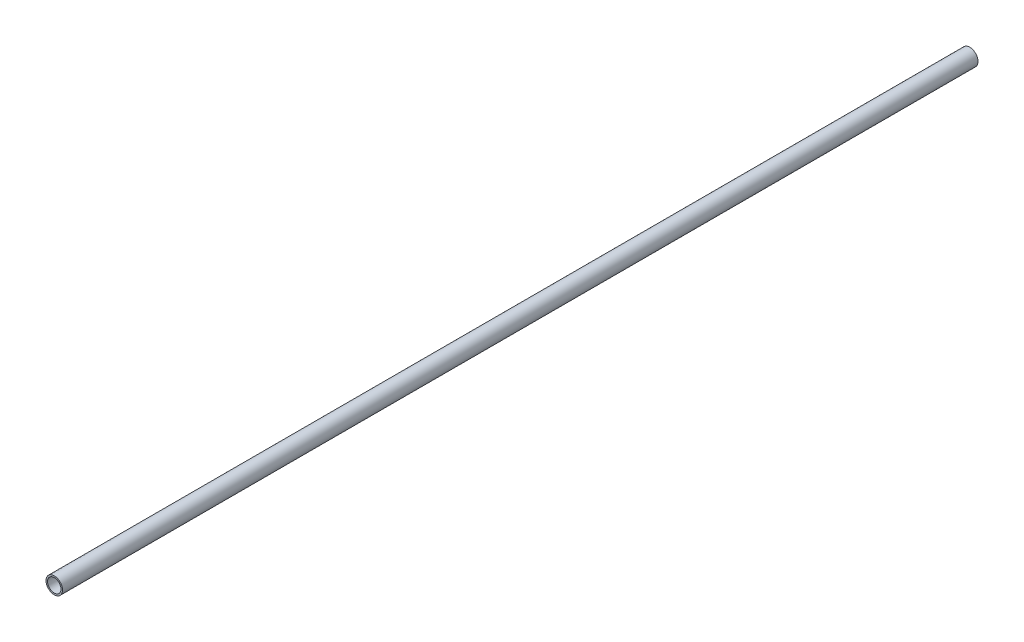
ISO-10303-21;
HEADER;
FILE_DESCRIPTION(('STEP AP214'),'2;1');
FILE_NAME('part.step','',(''),(''),'','','');
FILE_SCHEMA(('AUTOMOTIVE_DESIGN { 1 0 10303 214 1 1 1 1 }'));
ENDSEC;
DATA;
#1=APPLICATION_CONTEXT('core data for automotive mechanical design processes');
#2=APPLICATION_PROTOCOL_DEFINITION('international standard','automotive_design',2000,#1);
#3=PRODUCT_CONTEXT('',#1,'mechanical');
#4=PRODUCT('Part','Part','',(#3));
#5=PRODUCT_RELATED_PRODUCT_CATEGORY('part','',(#4));
#6=PRODUCT_DEFINITION_FORMATION('','',#4);
#7=PRODUCT_DEFINITION_CONTEXT('part definition',#1,'design');
#8=PRODUCT_DEFINITION('design','',#6,#7);
#9=PRODUCT_DEFINITION_SHAPE('','',#8);
#10=(LENGTH_UNIT() NAMED_UNIT(*) SI_UNIT(.MILLI.,.METRE.));
#11=(NAMED_UNIT(*) PLANE_ANGLE_UNIT() SI_UNIT($,.RADIAN.));
#12=(NAMED_UNIT(*) SI_UNIT($,.STERADIAN.) SOLID_ANGLE_UNIT());
#13=UNCERTAINTY_MEASURE_WITH_UNIT(LENGTH_MEASURE(1.E-05),#10,'distance_accuracy_value','');
#14=(GEOMETRIC_REPRESENTATION_CONTEXT(3) GLOBAL_UNCERTAINTY_ASSIGNED_CONTEXT((#13)) GLOBAL_UNIT_ASSIGNED_CONTEXT((#10,
#11,#12)) REPRESENTATION_CONTEXT('',''));
#15=CARTESIAN_POINT('',(0.,0.,0.));
#16=DIRECTION('',(0.,0.,1.));
#17=DIRECTION('',(1.,0.,0.));
#18=AXIS2_PLACEMENT_3D('',#15,#16,#17);
#19=CARTESIAN_POINT('',(0.,0.,1185.));
#20=DIRECTION('',(0.,0.,1.));
#21=DIRECTION('',(1.,0.,0.));
#22=AXIS2_PLACEMENT_3D('',#19,#20,#21);
#23=PLANE('',#22);
#24=CARTESIAN_POINT('',(0.,0.,1185.));
#25=DIRECTION('',(0.,0.,1.));
#26=DIRECTION('',(1.,0.,0.));
#27=AXIS2_PLACEMENT_3D('',#24,#25,#26);
#28=CIRCLE('',#27,21.35);
#29=CARTESIAN_POINT('',(-21.35,0.,1185.));
#30=VERTEX_POINT('',#29);
#31=EDGE_CURVE('E10',#30,#30,#28,.T.);
#32=ORIENTED_EDGE('',*,*,#31,.T.);
#33=EDGE_LOOP('',(#32));
#34=FACE_BOUND('',#33,.T.);
#35=CARTESIAN_POINT('',(0.,0.,1185.));
#36=DIRECTION('',(0.,0.,1.));
#37=DIRECTION('',(1.,0.,0.));
#38=AXIS2_PLACEMENT_3D('',#35,#36,#37);
#39=CIRCLE('',#38,17.35);
#40=CARTESIAN_POINT('',(-17.35,0.,1185.));
#41=VERTEX_POINT('',#40);
#42=EDGE_CURVE('E54',#41,#41,#39,.T.);
#43=ORIENTED_EDGE('',*,*,#42,.F.);
#44=EDGE_LOOP('',(#43));
#45=FACE_BOUND('',#44,.T.);
#46=ADVANCED_FACE('F40',(#34,#45),#23,.T.);
#47=CARTESIAN_POINT('',(0.,0.,-1185.));
#48=DIRECTION('',(0.,0.,1.));
#49=DIRECTION('',(1.,0.,0.));
#50=AXIS2_PLACEMENT_3D('',#47,#48,#49);
#51=PLANE('',#50);
#52=CARTESIAN_POINT('',(0.,0.,-1185.));
#53=DIRECTION('',(0.,0.,1.));
#54=DIRECTION('',(1.,0.,0.));
#55=AXIS2_PLACEMENT_3D('',#52,#53,#54);
#56=CIRCLE('',#55,21.35);
#57=CARTESIAN_POINT('',(-21.35,0.,-1185.));
#58=VERTEX_POINT('',#57);
#59=EDGE_CURVE('E44',#58,#58,#56,.T.);
#60=ORIENTED_EDGE('',*,*,#59,.F.);
#61=EDGE_LOOP('',(#60));
#62=FACE_BOUND('',#61,.T.);
#63=CARTESIAN_POINT('',(0.,0.,-1185.));
#64=DIRECTION('',(0.,0.,1.));
#65=DIRECTION('',(1.,0.,0.));
#66=AXIS2_PLACEMENT_3D('',#63,#64,#65);
#67=CIRCLE('',#66,17.35);
#68=CARTESIAN_POINT('',(-17.35,0.,-1185.));
#69=VERTEX_POINT('',#68);
#70=EDGE_CURVE('E56',#69,#69,#67,.T.);
#71=ORIENTED_EDGE('',*,*,#70,.T.);
#72=EDGE_LOOP('',(#71));
#73=FACE_BOUND('',#72,.T.);
#74=ADVANCED_FACE('F67',(#62,#73),#51,.F.);
#75=CARTESIAN_POINT('',(0.,0.,1185.));
#76=DIRECTION('',(0.,0.,-1.));
#77=DIRECTION('',(-1.,0.,0.));
#78=AXIS2_PLACEMENT_3D('',#75,#76,#77);
#79=CYLINDRICAL_SURFACE('',#78,21.35);
#80=CARTESIAN_POINT('',(-21.35,0.,1185.));
#81=CARTESIAN_POINT('',(-21.35,0.,1160.3125));
#82=CARTESIAN_POINT('',(-21.35,0.,1135.625));
#83=CARTESIAN_POINT('',(-21.35,0.,1086.25));
#84=CARTESIAN_POINT('',(-21.35,0.,1061.5625));
#85=CARTESIAN_POINT('',(-21.35,0.,1012.1875));
#86=CARTESIAN_POINT('',(-21.35,0.,987.5));
#87=CARTESIAN_POINT('',(-21.35,0.,938.125));
#88=CARTESIAN_POINT('',(-21.35,0.,913.4375));
#89=CARTESIAN_POINT('',(-21.35,0.,864.0625));
#90=CARTESIAN_POINT('',(-21.35,0.,839.375));
#91=CARTESIAN_POINT('',(-21.35,0.,790.));
#92=CARTESIAN_POINT('',(-21.35,0.,765.3125));
#93=CARTESIAN_POINT('',(-21.35,0.,715.9375));
#94=CARTESIAN_POINT('',(-21.35,0.,691.25));
#95=CARTESIAN_POINT('',(-21.35,0.,641.875));
#96=CARTESIAN_POINT('',(-21.35,0.,617.1875));
#97=CARTESIAN_POINT('',(-21.35,0.,567.8125));
#98=CARTESIAN_POINT('',(-21.35,0.,543.125));
#99=CARTESIAN_POINT('',(-21.35,0.,493.75));
#100=CARTESIAN_POINT('',(-21.35,0.,469.0625));
#101=CARTESIAN_POINT('',(-21.35,0.,419.6875));
#102=CARTESIAN_POINT('',(-21.35,0.,395.));
#103=CARTESIAN_POINT('',(-21.35,0.,345.625));
#104=CARTESIAN_POINT('',(-21.35,0.,320.9375));
#105=CARTESIAN_POINT('',(-21.35,0.,271.5625));
#106=CARTESIAN_POINT('',(-21.35,0.,246.875));
#107=CARTESIAN_POINT('',(-21.35,0.,197.5));
#108=CARTESIAN_POINT('',(-21.35,0.,172.8125));
#109=CARTESIAN_POINT('',(-21.35,0.,123.4375));
#110=CARTESIAN_POINT('',(-21.35,0.,98.7499999999997));
#111=CARTESIAN_POINT('',(-21.35,0.,49.3749999999997));
#112=CARTESIAN_POINT('',(-21.35,0.,24.6874999999996));
#113=CARTESIAN_POINT('',(-21.35,0.,-24.6875000000005));
#114=CARTESIAN_POINT('',(-21.35,0.,-49.3750000000005));
#115=CARTESIAN_POINT('',(-21.35,0.,-98.7500000000006));
#116=CARTESIAN_POINT('',(-21.35,0.,-123.437500000001));
#117=CARTESIAN_POINT('',(-21.35,0.,-172.8125));
#118=CARTESIAN_POINT('',(-21.35,0.,-197.5));
#119=CARTESIAN_POINT('',(-21.35,0.,-246.875));
#120=CARTESIAN_POINT('',(-21.35,0.,-271.562500000001));
#121=CARTESIAN_POINT('',(-21.35,0.,-320.937500000001));
#122=CARTESIAN_POINT('',(-21.35,0.,-345.625000000001));
#123=CARTESIAN_POINT('',(-21.35,0.,-395.000000000001));
#124=CARTESIAN_POINT('',(-21.35,0.,-419.687500000001));
#125=CARTESIAN_POINT('',(-21.35,0.,-469.062500000001));
#126=CARTESIAN_POINT('',(-21.35,0.,-493.750000000001));
#127=CARTESIAN_POINT('',(-21.35,0.,-543.125000000001));
#128=CARTESIAN_POINT('',(-21.35,0.,-567.812500000001));
#129=CARTESIAN_POINT('',(-21.35,0.,-617.187500000001));
#130=CARTESIAN_POINT('',(-21.35,0.,-641.875000000001));
#131=CARTESIAN_POINT('',(-21.35,0.,-691.250000000001));
#132=CARTESIAN_POINT('',(-21.35,0.,-715.937500000001));
#133=CARTESIAN_POINT('',(-21.35,0.,-765.312500000001));
#134=CARTESIAN_POINT('',(-21.35,0.,-790.000000000001));
#135=CARTESIAN_POINT('',(-21.35,0.,-839.375000000001));
#136=CARTESIAN_POINT('',(-21.35,0.,-864.0625));
#137=CARTESIAN_POINT('',(-21.35,0.,-913.4375));
#138=CARTESIAN_POINT('',(-21.35,0.,-938.125));
#139=CARTESIAN_POINT('',(-21.35,0.,-987.5));
#140=CARTESIAN_POINT('',(-21.35,0.,-1012.1875));
#141=CARTESIAN_POINT('',(-21.35,0.,-1061.5625));
#142=CARTESIAN_POINT('',(-21.35,0.,-1086.25));
#143=CARTESIAN_POINT('',(-21.35,0.,-1135.625));
#144=CARTESIAN_POINT('',(-21.35,0.,-1160.3125));
#145=CARTESIAN_POINT('',(-21.35,0.,-1185.));
#146=B_SPLINE_CURVE_WITH_KNOTS('',3,(#80,#81,#82,#83,#84,#85,#86,#87,#88,#89,#90,#91,#92,#93,
#94,#95,#96,#97,#98,#99,#100,#101,#102,#103,#104,#105,#106,#107,#108,#109,#110,#111,#112,#113,
#114,#115,#116,#117,#118,#119,#120,#121,#122,#123,#124,#125,#126,#127,#128,#129,#130,#131,#132,
#133,#134,#135,#136,#137,#138,#139,#140,#141,#142,#143,#144,#145),.UNSPECIFIED.,.F.,.F.,(4,2,2,
2,2,2,2,2,2,2,2,2,2,2,2,2,2,2,2,2,2,2,2,2,2,2,2,2,2,2,2,2,4),(0.,74.0624999999999,148.125,
222.1875,296.25,370.3125,444.375,518.4375,592.5,666.5625,740.625,814.6875,888.75,962.8125,
1036.875,1110.9375,1185.,1259.0625,1333.125,1407.1875,1481.25,1555.3125,1629.375,1703.4375,
1777.5,1851.5625,1925.625,1999.6875,2073.75,2147.8125,2221.875,2295.9375,2370.),.UNSPECIFIED.);
#147=EDGE_CURVE('BSEAM42',#30,#58,#146,.T.);
#148=ORIENTED_EDGE('',*,*,#31,.F.);
#149=ORIENTED_EDGE('',*,*,#59,.T.);
#150=ORIENTED_EDGE('',*,*,#147,.T.);
#151=ORIENTED_EDGE('',*,*,#147,.F.);
#152=EDGE_LOOP('',(#148,#150,#149,#151));
#153=FACE_BOUND('',#152,.T.);
#154=ADVANCED_FACE('F42',(#153),#79,.T.);
#155=CARTESIAN_POINT('',(0.,0.,1185.));
#156=DIRECTION('',(0.,0.,-1.));
#157=DIRECTION('',(-1.,0.,0.));
#158=AXIS2_PLACEMENT_3D('',#155,#156,#157);
#159=CYLINDRICAL_SURFACE('',#158,17.35);
#160=CARTESIAN_POINT('',(-17.35,0.,1185.));
#161=CARTESIAN_POINT('',(-17.35,0.,1160.3125));
#162=CARTESIAN_POINT('',(-17.35,0.,1135.625));
#163=CARTESIAN_POINT('',(-17.35,0.,1086.25));
#164=CARTESIAN_POINT('',(-17.35,0.,1061.5625));
#165=CARTESIAN_POINT('',(-17.35,0.,1012.1875));
#166=CARTESIAN_POINT('',(-17.35,0.,987.5));
#167=CARTESIAN_POINT('',(-17.35,0.,938.125));
#168=CARTESIAN_POINT('',(-17.35,0.,913.4375));
#169=CARTESIAN_POINT('',(-17.35,0.,864.0625));
#170=CARTESIAN_POINT('',(-17.35,0.,839.375));
#171=CARTESIAN_POINT('',(-17.35,0.,790.));
#172=CARTESIAN_POINT('',(-17.35,0.,765.3125));
#173=CARTESIAN_POINT('',(-17.35,0.,715.9375));
#174=CARTESIAN_POINT('',(-17.35,0.,691.25));
#175=CARTESIAN_POINT('',(-17.35,0.,641.875));
#176=CARTESIAN_POINT('',(-17.35,0.,617.1875));
#177=CARTESIAN_POINT('',(-17.35,0.,567.8125));
#178=CARTESIAN_POINT('',(-17.35,0.,543.125));
#179=CARTESIAN_POINT('',(-17.35,0.,493.75));
#180=CARTESIAN_POINT('',(-17.35,0.,469.0625));
#181=CARTESIAN_POINT('',(-17.35,0.,419.6875));
#182=CARTESIAN_POINT('',(-17.35,0.,395.));
#183=CARTESIAN_POINT('',(-17.35,0.,345.625));
#184=CARTESIAN_POINT('',(-17.35,0.,320.9375));
#185=CARTESIAN_POINT('',(-17.35,0.,271.5625));
#186=CARTESIAN_POINT('',(-17.35,0.,246.875));
#187=CARTESIAN_POINT('',(-17.35,0.,197.5));
#188=CARTESIAN_POINT('',(-17.35,0.,172.8125));
#189=CARTESIAN_POINT('',(-17.35,0.,123.4375));
#190=CARTESIAN_POINT('',(-17.35,0.,98.7499999999999));
#191=CARTESIAN_POINT('',(-17.35,0.,49.3749999999999));
#192=CARTESIAN_POINT('',(-17.35,0.,24.6874999999998));
#193=CARTESIAN_POINT('',(-17.35,0.,-24.6875000000003));
#194=CARTESIAN_POINT('',(-17.35,0.,-49.3750000000003));
#195=CARTESIAN_POINT('',(-17.35,0.,-98.7500000000003));
#196=CARTESIAN_POINT('',(-17.35,0.,-123.4375));
#197=CARTESIAN_POINT('',(-17.35,0.,-172.8125));
#198=CARTESIAN_POINT('',(-17.35,0.,-197.5));
#199=CARTESIAN_POINT('',(-17.35,0.,-246.875));
#200=CARTESIAN_POINT('',(-17.35,0.,-271.5625));
#201=CARTESIAN_POINT('',(-17.35,0.,-320.9375));
#202=CARTESIAN_POINT('',(-17.35,0.,-345.625));
#203=CARTESIAN_POINT('',(-17.35,0.,-395.));
#204=CARTESIAN_POINT('',(-17.35,0.,-419.6875));
#205=CARTESIAN_POINT('',(-17.35,0.,-469.0625));
#206=CARTESIAN_POINT('',(-17.35,0.,-493.75));
#207=CARTESIAN_POINT('',(-17.35,0.,-543.125));
#208=CARTESIAN_POINT('',(-17.35,0.,-567.8125));
#209=CARTESIAN_POINT('',(-17.35,0.,-617.187500000001));
#210=CARTESIAN_POINT('',(-17.35,0.,-641.875000000001));
#211=CARTESIAN_POINT('',(-17.35,0.,-691.250000000001));
#212=CARTESIAN_POINT('',(-17.35,0.,-715.937500000001));
#213=CARTESIAN_POINT('',(-17.35,0.,-765.3125));
#214=CARTESIAN_POINT('',(-17.35,0.,-790.));
#215=CARTESIAN_POINT('',(-17.35,0.,-839.375));
#216=CARTESIAN_POINT('',(-17.35,0.,-864.0625));
#217=CARTESIAN_POINT('',(-17.35,0.,-913.4375));
#218=CARTESIAN_POINT('',(-17.35,0.,-938.125));
#219=CARTESIAN_POINT('',(-17.35,0.,-987.5));
#220=CARTESIAN_POINT('',(-17.35,0.,-1012.1875));
#221=CARTESIAN_POINT('',(-17.35,0.,-1061.5625));
#222=CARTESIAN_POINT('',(-17.35,0.,-1086.25));
#223=CARTESIAN_POINT('',(-17.35,0.,-1135.625));
#224=CARTESIAN_POINT('',(-17.35,0.,-1160.3125));
#225=CARTESIAN_POINT('',(-17.35,0.,-1185.));
#226=B_SPLINE_CURVE_WITH_KNOTS('',3,(#160,#161,#162,#163,#164,#165,#166,#167,#168,#169,#170,
#171,#172,#173,#174,#175,#176,#177,#178,#179,#180,#181,#182,#183,#184,#185,#186,#187,#188,#189,
#190,#191,#192,#193,#194,#195,#196,#197,#198,#199,#200,#201,#202,#203,#204,#205,#206,#207,#208,
#209,#210,#211,#212,#213,#214,#215,#216,#217,#218,#219,#220,#221,#222,#223,#224,#225),
.UNSPECIFIED.,.F.,.F.,(4,2,2,2,2,2,2,2,2,2,2,2,2,2,2,2,2,2,2,2,2,2,2,2,2,2,2,2,2,2,2,2,4),(0.,
74.0625000000001,148.125,222.1875,296.25,370.3125,444.375,518.4375,592.5,666.5625,740.625,
814.6875,888.75,962.8125,1036.875,1110.9375,1185.,1259.0625,1333.125,1407.1875,1481.25,
1555.3125,1629.375,1703.4375,1777.5,1851.5625,1925.625,1999.6875,2073.75,2147.8125,2221.875,
2295.9375,2370.),.UNSPECIFIED.);
#227=EDGE_CURVE('BSEAM63',#41,#69,#226,.T.);
#228=ORIENTED_EDGE('',*,*,#42,.T.);
#229=ORIENTED_EDGE('',*,*,#70,.F.);
#230=ORIENTED_EDGE('',*,*,#227,.T.);
#231=ORIENTED_EDGE('',*,*,#227,.F.);
#232=EDGE_LOOP('',(#228,#230,#229,#231));
#233=FACE_BOUND('',#232,.T.);
#234=ADVANCED_FACE('F63',(#233),#159,.F.);
#235=CLOSED_SHELL('',(#46,#74,#154,#234));
#236=MANIFOLD_SOLID_BREP('B2',#235);
#237=ADVANCED_BREP_SHAPE_REPRESENTATION('',(#18,#236),#14);
#238=SHAPE_DEFINITION_REPRESENTATION(#9,#237);
ENDSEC;
END-ISO-10303-21;
